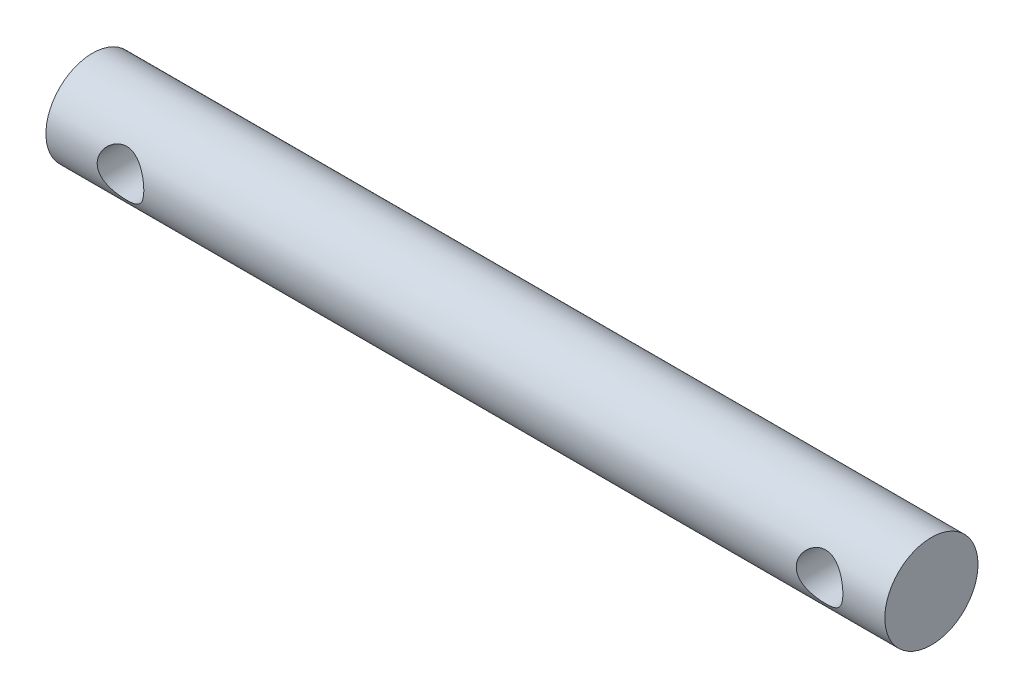
ISO-10303-21;
HEADER;
FILE_DESCRIPTION(('STEP AP214'),'2;1');
FILE_NAME('part.step','',(''),(''),'','','');
FILE_SCHEMA(('AUTOMOTIVE_DESIGN { 1 0 10303 214 1 1 1 1 }'));
ENDSEC;
DATA;
#1=APPLICATION_CONTEXT('core data for automotive mechanical design processes');
#2=APPLICATION_PROTOCOL_DEFINITION('international standard','automotive_design',2000,#1);
#3=PRODUCT_CONTEXT('',#1,'mechanical');
#4=PRODUCT('Part','Part','',(#3));
#5=PRODUCT_RELATED_PRODUCT_CATEGORY('part','',(#4));
#6=PRODUCT_DEFINITION_FORMATION('','',#4);
#7=PRODUCT_DEFINITION_CONTEXT('part definition',#1,'design');
#8=PRODUCT_DEFINITION('design','',#6,#7);
#9=PRODUCT_DEFINITION_SHAPE('','',#8);
#10=(LENGTH_UNIT() NAMED_UNIT(*) SI_UNIT(.MILLI.,.METRE.));
#11=(NAMED_UNIT(*) PLANE_ANGLE_UNIT() SI_UNIT($,.RADIAN.));
#12=(NAMED_UNIT(*) SI_UNIT($,.STERADIAN.) SOLID_ANGLE_UNIT());
#13=UNCERTAINTY_MEASURE_WITH_UNIT(LENGTH_MEASURE(1.E-05),#10,'distance_accuracy_value','');
#14=(GEOMETRIC_REPRESENTATION_CONTEXT(3) GLOBAL_UNCERTAINTY_ASSIGNED_CONTEXT((#13)) GLOBAL_UNIT_ASSIGNED_CONTEXT((#10,
#11,#12)) REPRESENTATION_CONTEXT('',''));
#15=CARTESIAN_POINT('',(0.,0.,0.));
#16=DIRECTION('',(0.,0.,1.));
#17=DIRECTION('',(1.,0.,0.));
#18=AXIS2_PLACEMENT_3D('',#15,#16,#17);
#19=CARTESIAN_POINT('',(-45.,0.,0.));
#20=DIRECTION('',(1.,0.,0.));
#21=DIRECTION('',(0.,0.,-1.));
#22=AXIS2_PLACEMENT_3D('',#19,#20,#21);
#23=CYLINDRICAL_SURFACE('',#22,2.5);
#24=CARTESIAN_POINT('',(-39.75,0.,-2.5));
#25=CARTESIAN_POINT('',(-39.7500041278994,-0.0657149536912328,-2.49999641755189));
#26=CARTESIAN_POINT('',(-39.7552125914021,-0.131508249622541,-2.49738113774397));
#27=CARTESIAN_POINT('',(-39.7758161004261,-0.261150294085531,-2.48717695046745));
#28=CARTESIAN_POINT('',(-39.7912304912471,-0.324995108391879,-2.47957859786229));
#29=CARTESIAN_POINT('',(-39.831492260771,-0.448666931100718,-2.46020349254139));
#30=CARTESIAN_POINT('',(-39.85630298031,-0.508508503673975,-2.448442989719));
#31=CARTESIAN_POINT('',(-39.9144632767062,-0.623090771008207,-2.42182220644723));
#32=CARTESIAN_POINT('',(-39.9478121803111,-0.677831867487563,-2.40696217041912));
#33=CARTESIAN_POINT('',(-40.0243965618566,-0.784384772202399,-2.37445322822571));
#34=CARTESIAN_POINT('',(-40.0681080990496,-0.835819013902638,-2.3566899890942));
#35=CARTESIAN_POINT('',(-40.1631518490588,-0.930974306083719,-2.32074962808431));
#36=CARTESIAN_POINT('',(-40.2144898147155,-0.974689478883456,-2.30257220261294));
#37=CARTESIAN_POINT('',(-40.3281041869042,-1.05656500056285,-2.26623688996684));
#38=CARTESIAN_POINT('',(-40.3909201229324,-1.09403166943955,-2.24818983712665));
#39=CARTESIAN_POINT('',(-40.5229591699828,-1.15771028361337,-2.21607473465401));
#40=CARTESIAN_POINT('',(-40.5921776609034,-1.18393026870792,-2.20200384508737));
#41=CARTESIAN_POINT('',(-40.7308313817774,-1.22266555273573,-2.18072333797261));
#42=CARTESIAN_POINT('',(-40.8000055650842,-1.23590732135055,-2.17315339479642));
#43=CARTESIAN_POINT('',(-40.9399735472243,-1.25053374163605,-2.1647736243566));
#44=CARTESIAN_POINT('',(-41.0107656760889,-1.25193011046634,-2.1639571167911));
#45=CARTESIAN_POINT('',(-41.1428575303942,-1.24335910896536,-2.16888662821561));
#46=CARTESIAN_POINT('',(-41.2042800390288,-1.23473069942102,-2.17385954577517));
#47=CARTESIAN_POINT('',(-41.3246523867163,-1.20867481132116,-2.18845285917313));
#48=CARTESIAN_POINT('',(-41.3836014316316,-1.19124452987206,-2.1980747353972));
#49=CARTESIAN_POINT('',(-41.4990364157071,-1.1477622254825,-2.22109345515926));
#50=CARTESIAN_POINT('',(-41.5554329984822,-1.12151883389499,-2.23457300829998));
#51=CARTESIAN_POINT('',(-41.6632928657375,-1.061302109585,-2.26379255351755));
#52=CARTESIAN_POINT('',(-41.7147539195001,-1.02732530476558,-2.27953355975238));
#53=CARTESIAN_POINT('',(-41.818151565929,-0.947582568640983,-2.31391447379107));
#54=CARTESIAN_POINT('',(-41.8693210919702,-0.900868072961599,-2.33266887795933));
#55=CARTESIAN_POINT('',(-41.9634192732386,-0.799444473426713,-2.36934529125509));
#56=CARTESIAN_POINT('',(-42.0063439900423,-0.744731570717853,-2.38726689948501));
#57=CARTESIAN_POINT('',(-42.0846070762872,-0.625645632289808,-2.42127484103705));
#58=CARTESIAN_POINT('',(-42.1195005905572,-0.560941989499259,-2.43723730202509));
#59=CARTESIAN_POINT('',(-42.1776212863038,-0.425582769360994,-2.46447351401553));
#60=CARTESIAN_POINT('',(-42.2008577312689,-0.354931970331593,-2.47575098679441));
#61=CARTESIAN_POINT('',(-42.2330942546458,-0.215958114575875,-2.49155417176795));
#62=CARTESIAN_POINT('',(-42.2431140446835,-0.147926913185403,-2.4965617287664));
#63=CARTESIAN_POINT('',(-42.2518309139181,-0.01097449993669,-2.50091266823877));
#64=CARTESIAN_POINT('',(-42.2505333570493,0.057946274837379,-2.5002587340164));
#65=CARTESIAN_POINT('',(-42.2372416394766,0.189041214982494,-2.49363990316801));
#66=CARTESIAN_POINT('',(-42.2260843340874,0.251324260062445,-2.48809057110237));
#67=CARTESIAN_POINT('',(-42.1947024101311,0.373008615377397,-2.47277714143524));
#68=CARTESIAN_POINT('',(-42.1744767919333,0.432409607113747,-2.46301257917916));
#69=CARTESIAN_POINT('',(-42.1250019169585,0.548610760562083,-2.43980314267087));
#70=CARTESIAN_POINT('',(-42.095511187354,0.605287996257694,-2.42626102212424));
#71=CARTESIAN_POINT('',(-42.0286155804424,0.713076702123653,-2.39679967896386));
#72=CARTESIAN_POINT('',(-41.9912073317582,0.764185787219104,-2.38087944457231));
#73=CARTESIAN_POINT('',(-41.9052994683339,0.864709611613317,-2.3463527667183));
#74=CARTESIAN_POINT('',(-41.856071414433,0.913465097280797,-2.32763606060552));
#75=CARTESIAN_POINT('',(-41.7500935609134,1.00232040139155,-2.29077989504843));
#76=CARTESIAN_POINT('',(-41.6933386014795,1.04241423211355,-2.27264084226908));
#77=CARTESIAN_POINT('',(-41.5704454322496,1.11463489312212,-2.23813990282585));
#78=CARTESIAN_POINT('',(-41.5039859172392,1.1462818698483,-2.2219066207934));
#79=CARTESIAN_POINT('',(-41.3656124153843,1.19760353251725,-2.19467590460158));
#80=CARTESIAN_POINT('',(-41.2937055918735,1.21729364485946,-2.18367172800773));
#81=CARTESIAN_POINT('',(-41.1538622214232,1.2423271093121,-2.16951876260834));
#82=CARTESIAN_POINT('',(-41.0862071832137,1.24886624550108,-2.16571729325614));
#83=CARTESIAN_POINT('',(-40.9506911660366,1.25086144297598,-2.16456693307719));
#84=CARTESIAN_POINT('',(-40.8828302890757,1.2463223082805,-2.16721524534441));
#85=CARTESIAN_POINT('',(-40.755645623085,1.22740765699032,-2.17797327562531));
#86=CARTESIAN_POINT('',(-40.6961244123195,1.21401039292849,-2.18553868102992));
#87=CARTESIAN_POINT('',(-40.5802398507191,1.1789691977808,-2.20463770234897));
#88=CARTESIAN_POINT('',(-40.523877522385,1.15732261394976,-2.21617259462095));
#89=CARTESIAN_POINT('',(-40.4117189362667,1.10476968162585,-2.2428566295566));
#90=CARTESIAN_POINT('',(-40.3562151227129,1.07333892227057,-2.25819652995238));
#91=CARTESIAN_POINT('',(-40.2509068297743,1.00268871454579,-2.29044164543238));
#92=CARTESIAN_POINT('',(-40.2011053368519,0.963465214048305,-2.30734767243153));
#93=CARTESIAN_POINT('',(-40.102322522053,0.872754158330796,-2.34327903949141));
#94=CARTESIAN_POINT('',(-40.0541761220476,0.820355528762708,-2.36231229139336));
#95=CARTESIAN_POINT('',(-39.9671712707204,0.707693507775343,-2.3984719031886));
#96=CARTESIAN_POINT('',(-39.9283178257171,0.647425904070975,-2.4155972326005));
#97=CARTESIAN_POINT('',(-39.8609545465472,0.519914496024926,-2.44622511981379));
#98=CARTESIAN_POINT('',(-39.8325197882357,0.45262437991826,-2.45970120703636));
#99=CARTESIAN_POINT('',(-39.7877397901013,0.313427626617733,-2.48126676704332));
#100=CARTESIAN_POINT('',(-39.771360191463,0.241534749528952,-2.48937154216165));
#101=CARTESIAN_POINT('',(-39.7576282361552,0.140752433104226,-2.49619327387079));
#102=CARTESIAN_POINT('',(-39.7547716989205,0.11270234929937,-2.49761706674002));
#103=CARTESIAN_POINT('',(-39.750956668104,0.0564396647589455,-2.49952121222331));
#104=CARTESIAN_POINT('',(-39.749998226911,0.028227059559226,-2.50000153879704));
#105=CARTESIAN_POINT('',(-39.75,0.,-2.5));
#106=B_SPLINE_CURVE_WITH_KNOTS('',3,(#24,#25,#26,#27,#28,#29,#30,#31,#32,#33,#34,#35,#36,#37,
#38,#39,#40,#41,#42,#43,#44,#45,#46,#47,#48,#49,#50,#51,#52,#53,#54,#55,#56,#57,#58,#59,#60,#61,
#62,#63,#64,#65,#66,#67,#68,#69,#70,#71,#72,#73,#74,#75,#76,#77,#78,#79,#80,#81,#82,#83,#84,#85,
#86,#87,#88,#89,#90,#91,#92,#93,#94,#95,#96,#97,#98,#99,#100,#101,#102,#103,#104,#105),
.UNSPECIFIED.,.T.,.F.,(4,2,2,2,2,2,2,2,2,2,2,2,2,2,2,2,2,2,2,2,2,2,2,2,2,2,2,2,2,2,2,2,2,2,2,2,
2,2,2,2,4),(0.,0.197030321775365,0.394435187136497,0.591077694365375,0.787704700726957,
0.996227198397609,1.20490779706754,1.42977158038441,1.65447434872851,1.86572515175287,
2.07676696661275,2.2625714051165,2.44843504907097,2.63862800210609,2.82890651575276,
3.04331176667347,3.25781918248357,3.4822877776805,3.70657771140348,3.91229113089181,
4.11790705639344,4.30758633132652,4.49728652038663,4.69241070034872,4.88761813435423,
5.10199513305522,5.31651985769289,5.54143352699592,5.76605639925971,5.96911634372966,
6.17208824825006,6.35572412805227,6.53941910979596,6.73545570969516,6.93159451423696,
7.15156553440622,7.37165479220715,7.59330017078655,7.81431135781161,7.8989410017212,
7.98357298143556),.UNSPECIFIED.);
#107=CARTESIAN_POINT('',(-39.75,0.,-2.5));
#108=VERTEX_POINT('',#107);
#109=EDGE_CURVE('E10',#108,#108,#106,.T.);
#110=ORIENTED_EDGE('',*,*,#109,.F.);
#111=EDGE_LOOP('',(#110));
#112=FACE_BOUND('',#111,.T.);
#113=CARTESIAN_POINT('',(-39.75,0.,2.5));
#114=CARTESIAN_POINT('',(-39.7500041278994,0.0657149536912328,2.49999641755189));
#115=CARTESIAN_POINT('',(-39.7552125914021,0.131508249622541,2.49738113774397));
#116=CARTESIAN_POINT('',(-39.7758161004261,0.261150294085531,2.48717695046745));
#117=CARTESIAN_POINT('',(-39.7912304912471,0.324995108391879,2.47957859786229));
#118=CARTESIAN_POINT('',(-39.831492260771,0.448666931100718,2.46020349254139));
#119=CARTESIAN_POINT('',(-39.85630298031,0.508508503673975,2.448442989719));
#120=CARTESIAN_POINT('',(-39.9144632767062,0.623090771008207,2.42182220644723));
#121=CARTESIAN_POINT('',(-39.9478121803111,0.677831867487563,2.40696217041912));
#122=CARTESIAN_POINT('',(-40.0243965618566,0.784384772202399,2.37445322822571));
#123=CARTESIAN_POINT('',(-40.0681080990496,0.835819013902638,2.3566899890942));
#124=CARTESIAN_POINT('',(-40.1631518490588,0.930974306083719,2.32074962808431));
#125=CARTESIAN_POINT('',(-40.2144898147155,0.974689478883456,2.30257220261294));
#126=CARTESIAN_POINT('',(-40.3281041869042,1.05656500056285,2.26623688996684));
#127=CARTESIAN_POINT('',(-40.3909201229324,1.09403166943955,2.24818983712665));
#128=CARTESIAN_POINT('',(-40.5229591699828,1.15771028361337,2.21607473465401));
#129=CARTESIAN_POINT('',(-40.5921776609034,1.18393026870792,2.20200384508737));
#130=CARTESIAN_POINT('',(-40.7308313817774,1.22266555273573,2.18072333797261));
#131=CARTESIAN_POINT('',(-40.8000055650842,1.23590732135055,2.17315339479642));
#132=CARTESIAN_POINT('',(-40.9399735472243,1.25053374163605,2.1647736243566));
#133=CARTESIAN_POINT('',(-41.0107656760889,1.25193011046634,2.1639571167911));
#134=CARTESIAN_POINT('',(-41.1428575303942,1.24335910896536,2.16888662821561));
#135=CARTESIAN_POINT('',(-41.2042800390288,1.23473069942102,2.17385954577517));
#136=CARTESIAN_POINT('',(-41.3246523867163,1.20867481132116,2.18845285917313));
#137=CARTESIAN_POINT('',(-41.3836014316316,1.19124452987206,2.1980747353972));
#138=CARTESIAN_POINT('',(-41.4990364157071,1.1477622254825,2.22109345515926));
#139=CARTESIAN_POINT('',(-41.5554329984822,1.12151883389499,2.23457300829998));
#140=CARTESIAN_POINT('',(-41.6632928657375,1.061302109585,2.26379255351755));
#141=CARTESIAN_POINT('',(-41.7147539195001,1.02732530476558,2.27953355975238));
#142=CARTESIAN_POINT('',(-41.818151565929,0.947582568640983,2.31391447379107));
#143=CARTESIAN_POINT('',(-41.8693210919702,0.900868072961599,2.33266887795933));
#144=CARTESIAN_POINT('',(-41.9634192732386,0.799444473426713,2.36934529125509));
#145=CARTESIAN_POINT('',(-42.0063439900423,0.744731570717853,2.38726689948501));
#146=CARTESIAN_POINT('',(-42.0846070762872,0.625645632289808,2.42127484103705));
#147=CARTESIAN_POINT('',(-42.1195005905572,0.560941989499259,2.43723730202509));
#148=CARTESIAN_POINT('',(-42.1776212863038,0.425582769360994,2.46447351401553));
#149=CARTESIAN_POINT('',(-42.2008577312689,0.354931970331593,2.47575098679441));
#150=CARTESIAN_POINT('',(-42.2330942546458,0.215958114575875,2.49155417176795));
#151=CARTESIAN_POINT('',(-42.2431140446835,0.147926913185403,2.4965617287664));
#152=CARTESIAN_POINT('',(-42.2518309139181,0.01097449993669,2.50091266823877));
#153=CARTESIAN_POINT('',(-42.2505333570493,-0.057946274837379,2.5002587340164));
#154=CARTESIAN_POINT('',(-42.2372416394766,-0.189041214982494,2.49363990316801));
#155=CARTESIAN_POINT('',(-42.2260843340874,-0.251324260062445,2.48809057110237));
#156=CARTESIAN_POINT('',(-42.1947024101311,-0.373008615377397,2.47277714143524));
#157=CARTESIAN_POINT('',(-42.1744767919333,-0.432409607113747,2.46301257917916));
#158=CARTESIAN_POINT('',(-42.1250019169585,-0.548610760562083,2.43980314267087));
#159=CARTESIAN_POINT('',(-42.095511187354,-0.605287996257694,2.42626102212424));
#160=CARTESIAN_POINT('',(-42.0286155804424,-0.713076702123653,2.39679967896386));
#161=CARTESIAN_POINT('',(-41.9912073317582,-0.764185787219104,2.38087944457231));
#162=CARTESIAN_POINT('',(-41.9052994683339,-0.864709611613317,2.3463527667183));
#163=CARTESIAN_POINT('',(-41.856071414433,-0.913465097280797,2.32763606060552));
#164=CARTESIAN_POINT('',(-41.7500935609134,-1.00232040139155,2.29077989504843));
#165=CARTESIAN_POINT('',(-41.6933386014795,-1.04241423211355,2.27264084226908));
#166=CARTESIAN_POINT('',(-41.5704454322496,-1.11463489312212,2.23813990282585));
#167=CARTESIAN_POINT('',(-41.5039859172392,-1.1462818698483,2.2219066207934));
#168=CARTESIAN_POINT('',(-41.3656124153843,-1.19760353251725,2.19467590460158));
#169=CARTESIAN_POINT('',(-41.2937055918735,-1.21729364485946,2.18367172800773));
#170=CARTESIAN_POINT('',(-41.1538622214232,-1.2423271093121,2.16951876260834));
#171=CARTESIAN_POINT('',(-41.0862071832137,-1.24886624550108,2.16571729325614));
#172=CARTESIAN_POINT('',(-40.9506911660366,-1.25086144297598,2.16456693307719));
#173=CARTESIAN_POINT('',(-40.8828302890757,-1.2463223082805,2.16721524534441));
#174=CARTESIAN_POINT('',(-40.755645623085,-1.22740765699032,2.17797327562531));
#175=CARTESIAN_POINT('',(-40.6961244123195,-1.21401039292849,2.18553868102992));
#176=CARTESIAN_POINT('',(-40.5802398507191,-1.1789691977808,2.20463770234897));
#177=CARTESIAN_POINT('',(-40.523877522385,-1.15732261394976,2.21617259462095));
#178=CARTESIAN_POINT('',(-40.4117189362667,-1.10476968162585,2.2428566295566));
#179=CARTESIAN_POINT('',(-40.3562151227129,-1.07333892227057,2.25819652995238));
#180=CARTESIAN_POINT('',(-40.2509068297743,-1.00268871454579,2.29044164543238));
#181=CARTESIAN_POINT('',(-40.2011053368519,-0.963465214048305,2.30734767243153));
#182=CARTESIAN_POINT('',(-40.102322522053,-0.872754158330796,2.34327903949141));
#183=CARTESIAN_POINT('',(-40.0541761220476,-0.820355528762708,2.36231229139336));
#184=CARTESIAN_POINT('',(-39.9671712707204,-0.707693507775343,2.3984719031886));
#185=CARTESIAN_POINT('',(-39.9283178257171,-0.647425904070975,2.4155972326005));
#186=CARTESIAN_POINT('',(-39.8609545465472,-0.519914496024926,2.44622511981379));
#187=CARTESIAN_POINT('',(-39.8325197882357,-0.45262437991826,2.45970120703636));
#188=CARTESIAN_POINT('',(-39.7877397901013,-0.313427626617733,2.48126676704332));
#189=CARTESIAN_POINT('',(-39.771360191463,-0.241534749528952,2.48937154216165));
#190=CARTESIAN_POINT('',(-39.7576282361552,-0.140752433104226,2.49619327387079));
#191=CARTESIAN_POINT('',(-39.7547716989205,-0.11270234929937,2.49761706674002));
#192=CARTESIAN_POINT('',(-39.750956668104,-0.0564396647589455,2.49952121222331));
#193=CARTESIAN_POINT('',(-39.749998226911,-0.028227059559226,2.50000153879704));
#194=CARTESIAN_POINT('',(-39.75,0.,2.5));
#195=B_SPLINE_CURVE_WITH_KNOTS('',3,(#113,#114,#115,#116,#117,#118,#119,#120,#121,#122,#123,
#124,#125,#126,#127,#128,#129,#130,#131,#132,#133,#134,#135,#136,#137,#138,#139,#140,#141,#142,
#143,#144,#145,#146,#147,#148,#149,#150,#151,#152,#153,#154,#155,#156,#157,#158,#159,#160,#161,
#162,#163,#164,#165,#166,#167,#168,#169,#170,#171,#172,#173,#174,#175,#176,#177,#178,#179,#180,
#181,#182,#183,#184,#185,#186,#187,#188,#189,#190,#191,#192,#193,#194),.UNSPECIFIED.,.T.,.F.,(4,
2,2,2,2,2,2,2,2,2,2,2,2,2,2,2,2,2,2,2,2,2,2,2,2,2,2,2,2,2,2,2,2,2,2,2,2,2,2,2,4),(0.,
0.197030321775365,0.394435187136497,0.591077694365375,0.787704700726957,0.996227198397609,
1.20490779706754,1.42977158038441,1.65447434872851,1.86572515175287,2.07676696661275,
2.2625714051165,2.44843504907097,2.63862800210609,2.82890651575276,3.04331176667347,
3.25781918248357,3.4822877776805,3.70657771140348,3.91229113089181,4.11790705639344,
4.30758633132652,4.49728652038663,4.69241070034872,4.88761813435423,5.10199513305522,
5.31651985769289,5.54143352699592,5.76605639925971,5.96911634372966,6.17208824825006,
6.35572412805227,6.53941910979596,6.73545570969516,6.93159451423696,7.15156553440622,
7.37165479220715,7.59330017078655,7.81431135781161,7.8989410017212,7.98357298143556),.UNSPECIFIED.);
#196=CARTESIAN_POINT('',(-39.75,0.,2.5));
#197=VERTEX_POINT('',#196);
#198=EDGE_CURVE('E48',#197,#197,#195,.T.);
#199=ORIENTED_EDGE('',*,*,#198,.F.);
#200=EDGE_LOOP('',(#199));
#201=FACE_BOUND('',#200,.T.);
#202=CARTESIAN_POINT('',(-2.25,0.,-2.5));
#203=CARTESIAN_POINT('',(-2.25000412789938,-0.0657149536912332,-2.49999641755189));
#204=CARTESIAN_POINT('',(-2.25521259140209,-0.131508249622541,-2.49738113774397));
#205=CARTESIAN_POINT('',(-2.27581610042615,-0.261150294085532,-2.48717695046745));
#206=CARTESIAN_POINT('',(-2.29123049124706,-0.32499510839188,-2.47957859786229));
#207=CARTESIAN_POINT('',(-2.33149226077099,-0.448666931100718,-2.46020349254139));
#208=CARTESIAN_POINT('',(-2.35630298031002,-0.508508503673975,-2.448442989719));
#209=CARTESIAN_POINT('',(-2.41446327670618,-0.623090771008207,-2.42182220644723));
#210=CARTESIAN_POINT('',(-2.44781218031107,-0.677831867487563,-2.40696217041912));
#211=CARTESIAN_POINT('',(-2.52439656185662,-0.784384772202399,-2.37445322822571));
#212=CARTESIAN_POINT('',(-2.56810809904955,-0.83581901390264,-2.3566899890942));
#213=CARTESIAN_POINT('',(-2.66315184905879,-0.930974306083722,-2.3207496280843));
#214=CARTESIAN_POINT('',(-2.71448981471555,-0.974689478883458,-2.30257220261294));
#215=CARTESIAN_POINT('',(-2.82810418690423,-1.05656500056285,-2.26623688996684));
#216=CARTESIAN_POINT('',(-2.89092012293239,-1.09403166943955,-2.24818983712665));
#217=CARTESIAN_POINT('',(-3.02295916998277,-1.15771028361337,-2.21607473465401));
#218=CARTESIAN_POINT('',(-3.09217766090344,-1.18393026870792,-2.20200384508737));
#219=CARTESIAN_POINT('',(-3.2308313817774,-1.22266555273574,-2.18072333797261));
#220=CARTESIAN_POINT('',(-3.30000556508424,-1.23590732135055,-2.17315339479642));
#221=CARTESIAN_POINT('',(-3.43997354722435,-1.25053374163606,-2.1647736243566));
#222=CARTESIAN_POINT('',(-3.51076567608894,-1.25193011046634,-2.1639571167911));
#223=CARTESIAN_POINT('',(-3.64285753039421,-1.24335910896537,-2.16888662821561));
#224=CARTESIAN_POINT('',(-3.70428003902881,-1.23473069942103,-2.17385954577517));
#225=CARTESIAN_POINT('',(-3.8246523867163,-1.20867481132117,-2.18845285917313));
#226=CARTESIAN_POINT('',(-3.88360143163164,-1.19124452987206,-2.1980747353972));
#227=CARTESIAN_POINT('',(-3.99903641570707,-1.1477622254825,-2.22109345515926));
#228=CARTESIAN_POINT('',(-4.05543299848223,-1.12151883389499,-2.23457300829998));
#229=CARTESIAN_POINT('',(-4.16329286573751,-1.061302109585,-2.26379255351755));
#230=CARTESIAN_POINT('',(-4.21475391950011,-1.02732530476558,-2.27953355975238));
#231=CARTESIAN_POINT('',(-4.31815156592903,-0.947582568640985,-2.31391447379107));
#232=CARTESIAN_POINT('',(-4.3693210919702,-0.900868072961602,-2.33266887795933));
#233=CARTESIAN_POINT('',(-4.46341927323863,-0.799444473426716,-2.36934529125509));
#234=CARTESIAN_POINT('',(-4.50634399004235,-0.744731570717856,-2.38726689948501));
#235=CARTESIAN_POINT('',(-4.58460707628716,-0.625645632289809,-2.42127484103705));
#236=CARTESIAN_POINT('',(-4.61950059055718,-0.560941989499259,-2.43723730202509));
#237=CARTESIAN_POINT('',(-4.67762128630376,-0.425582769360995,-2.46447351401553));
#238=CARTESIAN_POINT('',(-4.70085773126896,-0.354931970331594,-2.47575098679441));
#239=CARTESIAN_POINT('',(-4.73309425464584,-0.215958114575876,-2.49155417176795));
#240=CARTESIAN_POINT('',(-4.74311404468347,-0.147926913185404,-2.4965617287664));
#241=CARTESIAN_POINT('',(-4.75183091391811,-0.0109744999366908,-2.50091266823877));
#242=CARTESIAN_POINT('',(-4.75053335704935,0.057946274837378,-2.5002587340164));
#243=CARTESIAN_POINT('',(-4.73724163947656,0.189041214982493,-2.49363990316801));
#244=CARTESIAN_POINT('',(-4.72608433408746,0.251324260062444,-2.48809057110237));
#245=CARTESIAN_POINT('',(-4.69470241013114,0.373008615377397,-2.47277714143524));
#246=CARTESIAN_POINT('',(-4.6744767919333,0.432409607113746,-2.46301257917916));
#247=CARTESIAN_POINT('',(-4.62500191695853,0.548610760562082,-2.43980314267087));
#248=CARTESIAN_POINT('',(-4.59551118735398,0.605287996257692,-2.42626102212424));
#249=CARTESIAN_POINT('',(-4.52861558044245,0.713076702123651,-2.39679967896386));
#250=CARTESIAN_POINT('',(-4.49120733175821,0.764185787219102,-2.38087944457231));
#251=CARTESIAN_POINT('',(-4.40529946833391,0.864709611613316,-2.34635276671831));
#252=CARTESIAN_POINT('',(-4.35607141443304,0.913465097280798,-2.32763606060552));
#253=CARTESIAN_POINT('',(-4.25009356091337,1.00232040139155,-2.29077989504843));
#254=CARTESIAN_POINT('',(-4.19333860147953,1.04241423211355,-2.27264084226908));
#255=CARTESIAN_POINT('',(-4.07044543224961,1.11463489312212,-2.23813990282585));
#256=CARTESIAN_POINT('',(-4.00398591723926,1.1462818698483,-2.2219066207934));
#257=CARTESIAN_POINT('',(-3.86561241538435,1.19760353251725,-2.19467590460158));
#258=CARTESIAN_POINT('',(-3.79370559187352,1.21729364485946,-2.18367172800773));
#259=CARTESIAN_POINT('',(-3.65386222142319,1.2423271093121,-2.16951876260834));
#260=CARTESIAN_POINT('',(-3.5862071832137,1.24886624550108,-2.16571729325614));
#261=CARTESIAN_POINT('',(-3.45069116603659,1.25086144297598,-2.16456693307719));
#262=CARTESIAN_POINT('',(-3.38283028907571,1.2463223082805,-2.16721524534441));
#263=CARTESIAN_POINT('',(-3.25564562308498,1.22740765699033,-2.17797327562531));
#264=CARTESIAN_POINT('',(-3.1961244123195,1.2140103929285,-2.18553868102992));
#265=CARTESIAN_POINT('',(-3.08023985071912,1.17896919778081,-2.20463770234897));
#266=CARTESIAN_POINT('',(-3.02387752238504,1.15732261394976,-2.21617259462095));
#267=CARTESIAN_POINT('',(-2.91171893626674,1.10476968162585,-2.2428566295566));
#268=CARTESIAN_POINT('',(-2.85621512271287,1.07333892227057,-2.25819652995238));
#269=CARTESIAN_POINT('',(-2.75090682977427,1.00268871454579,-2.29044164543238));
#270=CARTESIAN_POINT('',(-2.70110533685189,0.963465214048309,-2.30734767243153));
#271=CARTESIAN_POINT('',(-2.60232252205298,0.8727541583308,-2.34327903949141));
#272=CARTESIAN_POINT('',(-2.5541761220476,0.820355528762713,-2.36231229139336));
#273=CARTESIAN_POINT('',(-2.46717127072046,0.707693507775348,-2.3984719031886));
#274=CARTESIAN_POINT('',(-2.42831782571714,0.647425904070981,-2.4155972326005));
#275=CARTESIAN_POINT('',(-2.36095454654725,0.519914496024933,-2.44622511981379));
#276=CARTESIAN_POINT('',(-2.33251978823571,0.452624379918268,-2.45970120703636));
#277=CARTESIAN_POINT('',(-2.28773979010131,0.313427626617739,-2.48126676704332));
#278=CARTESIAN_POINT('',(-2.27136019146303,0.241534749528957,-2.48937154216165));
#279=CARTESIAN_POINT('',(-2.25762823615519,0.14075243310423,-2.49619327387079));
#280=CARTESIAN_POINT('',(-2.25477169892048,0.112702349299373,-2.49761706674002));
#281=CARTESIAN_POINT('',(-2.25095666810399,0.056439664758947,-2.49952121222331));
#282=CARTESIAN_POINT('',(-2.249998226911,0.0282270595592267,-2.50000153879704));
#283=CARTESIAN_POINT('',(-2.25,0.,-2.5));
#284=B_SPLINE_CURVE_WITH_KNOTS('',3,(#202,#203,#204,#205,#206,#207,#208,#209,#210,#211,#212,
#213,#214,#215,#216,#217,#218,#219,#220,#221,#222,#223,#224,#225,#226,#227,#228,#229,#230,#231,
#232,#233,#234,#235,#236,#237,#238,#239,#240,#241,#242,#243,#244,#245,#246,#247,#248,#249,#250,
#251,#252,#253,#254,#255,#256,#257,#258,#259,#260,#261,#262,#263,#264,#265,#266,#267,#268,#269,
#270,#271,#272,#273,#274,#275,#276,#277,#278,#279,#280,#281,#282,#283),.UNSPECIFIED.,.T.,.F.,(4,
2,2,2,2,2,2,2,2,2,2,2,2,2,2,2,2,2,2,2,2,2,2,2,2,2,2,2,2,2,2,2,2,2,2,2,2,2,2,2,4),(0.,
0.197030321775366,0.394435187136498,0.591077694365373,0.78770470072696,0.996227198397612,
1.20490779706755,1.42977158038441,1.65447434872851,1.86572515175287,2.07676696661275,
2.2625714051165,2.44843504907098,2.63862800210609,2.82890651575277,3.04331176667348,
3.25781918248358,3.48228777768051,3.70657771140349,3.91229113089182,4.11790705639345,
4.30758633132652,4.49728652038664,4.69241070034873,4.88761813435424,5.10199513305523,
5.31651985769289,5.54143352699592,5.76605639925972,5.96911634372967,6.17208824825007,
6.35572412805228,6.53941910979598,6.73545570969518,6.93159451423697,7.15156553440623,
7.37165479220716,7.59330017078656,7.81431135781162,7.89894100172122,7.98357298143558),.UNSPECIFIED.);
#285=CARTESIAN_POINT('',(-2.25,0.,-2.5));
#286=VERTEX_POINT('',#285);
#287=EDGE_CURVE('E55',#286,#286,#284,.T.);
#288=ORIENTED_EDGE('',*,*,#287,.F.);
#289=EDGE_LOOP('',(#288));
#290=FACE_BOUND('',#289,.T.);
#291=CARTESIAN_POINT('',(-2.25,0.,2.5));
#292=CARTESIAN_POINT('',(-2.25000412789938,0.0657149536912332,2.49999641755189));
#293=CARTESIAN_POINT('',(-2.25521259140209,0.131508249622541,2.49738113774397));
#294=CARTESIAN_POINT('',(-2.27581610042615,0.261150294085532,2.48717695046745));
#295=CARTESIAN_POINT('',(-2.29123049124706,0.32499510839188,2.47957859786229));
#296=CARTESIAN_POINT('',(-2.33149226077099,0.448666931100718,2.46020349254139));
#297=CARTESIAN_POINT('',(-2.35630298031002,0.508508503673975,2.448442989719));
#298=CARTESIAN_POINT('',(-2.41446327670618,0.623090771008207,2.42182220644723));
#299=CARTESIAN_POINT('',(-2.44781218031107,0.677831867487563,2.40696217041912));
#300=CARTESIAN_POINT('',(-2.52439656185662,0.784384772202399,2.37445322822571));
#301=CARTESIAN_POINT('',(-2.56810809904955,0.83581901390264,2.3566899890942));
#302=CARTESIAN_POINT('',(-2.66315184905879,0.930974306083722,2.3207496280843));
#303=CARTESIAN_POINT('',(-2.71448981471555,0.974689478883459,2.30257220261294));
#304=CARTESIAN_POINT('',(-2.82810418690423,1.05656500056285,2.26623688996684));
#305=CARTESIAN_POINT('',(-2.89092012293239,1.09403166943955,2.24818983712665));
#306=CARTESIAN_POINT('',(-3.02295916998277,1.15771028361337,2.21607473465401));
#307=CARTESIAN_POINT('',(-3.09217766090344,1.18393026870792,2.20200384508737));
#308=CARTESIAN_POINT('',(-3.2308313817774,1.22266555273574,2.18072333797261));
#309=CARTESIAN_POINT('',(-3.30000556508424,1.23590732135055,2.17315339479642));
#310=CARTESIAN_POINT('',(-3.43997354722435,1.25053374163606,2.1647736243566));
#311=CARTESIAN_POINT('',(-3.51076567608894,1.25193011046634,2.1639571167911));
#312=CARTESIAN_POINT('',(-3.64285753039421,1.24335910896537,2.16888662821561));
#313=CARTESIAN_POINT('',(-3.70428003902881,1.23473069942103,2.17385954577517));
#314=CARTESIAN_POINT('',(-3.8246523867163,1.20867481132117,2.18845285917313));
#315=CARTESIAN_POINT('',(-3.88360143163164,1.19124452987206,2.1980747353972));
#316=CARTESIAN_POINT('',(-3.99903641570707,1.1477622254825,2.22109345515926));
#317=CARTESIAN_POINT('',(-4.05543299848223,1.12151883389499,2.23457300829998));
#318=CARTESIAN_POINT('',(-4.16329286573751,1.061302109585,2.26379255351755));
#319=CARTESIAN_POINT('',(-4.21475391950011,1.02732530476558,2.27953355975238));
#320=CARTESIAN_POINT('',(-4.31815156592903,0.947582568640985,2.31391447379107));
#321=CARTESIAN_POINT('',(-4.3693210919702,0.900868072961602,2.33266887795933));
#322=CARTESIAN_POINT('',(-4.46341927323863,0.799444473426716,2.36934529125509));
#323=CARTESIAN_POINT('',(-4.50634399004235,0.744731570717856,2.38726689948501));
#324=CARTESIAN_POINT('',(-4.58460707628716,0.625645632289809,2.42127484103705));
#325=CARTESIAN_POINT('',(-4.61950059055718,0.560941989499259,2.43723730202509));
#326=CARTESIAN_POINT('',(-4.67762128630376,0.425582769360994,2.46447351401553));
#327=CARTESIAN_POINT('',(-4.70085773126896,0.354931970331594,2.47575098679441));
#328=CARTESIAN_POINT('',(-4.73309425464584,0.215958114575876,2.49155417176795));
#329=CARTESIAN_POINT('',(-4.74311404468347,0.147926913185404,2.4965617287664));
#330=CARTESIAN_POINT('',(-4.75183091391811,0.0109744999366908,2.50091266823877));
#331=CARTESIAN_POINT('',(-4.75053335704935,-0.0579462748373778,2.5002587340164));
#332=CARTESIAN_POINT('',(-4.73724163947656,-0.189041214982493,2.49363990316801));
#333=CARTESIAN_POINT('',(-4.72608433408746,-0.251324260062443,2.48809057110237));
#334=CARTESIAN_POINT('',(-4.69470241013114,-0.373008615377396,2.47277714143524));
#335=CARTESIAN_POINT('',(-4.6744767919333,-0.432409607113746,2.46301257917916));
#336=CARTESIAN_POINT('',(-4.62500191695853,-0.548610760562082,2.43980314267087));
#337=CARTESIAN_POINT('',(-4.59551118735398,-0.605287996257692,2.42626102212424));
#338=CARTESIAN_POINT('',(-4.52861558044245,-0.713076702123651,2.39679967896386));
#339=CARTESIAN_POINT('',(-4.49120733175821,-0.764185787219102,2.38087944457231));
#340=CARTESIAN_POINT('',(-4.40529946833391,-0.864709611613316,2.34635276671831));
#341=CARTESIAN_POINT('',(-4.35607141443304,-0.913465097280798,2.32763606060552));
#342=CARTESIAN_POINT('',(-4.25009356091337,-1.00232040139155,2.29077989504843));
#343=CARTESIAN_POINT('',(-4.19333860147953,-1.04241423211355,2.27264084226908));
#344=CARTESIAN_POINT('',(-4.07044543224961,-1.11463489312212,2.23813990282585));
#345=CARTESIAN_POINT('',(-4.00398591723926,-1.1462818698483,2.2219066207934));
#346=CARTESIAN_POINT('',(-3.86561241538435,-1.19760353251725,2.19467590460158));
#347=CARTESIAN_POINT('',(-3.79370559187352,-1.21729364485946,2.18367172800773));
#348=CARTESIAN_POINT('',(-3.65386222142319,-1.2423271093121,2.16951876260834));
#349=CARTESIAN_POINT('',(-3.5862071832137,-1.24886624550108,2.16571729325614));
#350=CARTESIAN_POINT('',(-3.45069116603659,-1.25086144297598,2.16456693307719));
#351=CARTESIAN_POINT('',(-3.38283028907571,-1.2463223082805,2.16721524534441));
#352=CARTESIAN_POINT('',(-3.25564562308498,-1.22740765699033,2.17797327562531));
#353=CARTESIAN_POINT('',(-3.1961244123195,-1.2140103929285,2.18553868102992));
#354=CARTESIAN_POINT('',(-3.08023985071912,-1.17896919778081,2.20463770234897));
#355=CARTESIAN_POINT('',(-3.02387752238504,-1.15732261394976,2.21617259462095));
#356=CARTESIAN_POINT('',(-2.91171893626674,-1.10476968162585,2.2428566295566));
#357=CARTESIAN_POINT('',(-2.85621512271287,-1.07333892227057,2.25819652995238));
#358=CARTESIAN_POINT('',(-2.75090682977427,-1.00268871454579,2.29044164543238));
#359=CARTESIAN_POINT('',(-2.70110533685189,-0.96346521404831,2.30734767243153));
#360=CARTESIAN_POINT('',(-2.60232252205298,-0.872754158330801,2.34327903949141));
#361=CARTESIAN_POINT('',(-2.5541761220476,-0.820355528762714,2.36231229139336));
#362=CARTESIAN_POINT('',(-2.46717127072046,-0.70769350777535,2.3984719031886));
#363=CARTESIAN_POINT('',(-2.42831782571714,-0.647425904070982,2.4155972326005));
#364=CARTESIAN_POINT('',(-2.36095454654725,-0.519914496024934,2.44622511981379));
#365=CARTESIAN_POINT('',(-2.33251978823571,-0.452624379918268,2.45970120703636));
#366=CARTESIAN_POINT('',(-2.28773979010131,-0.313427626617739,2.48126676704332));
#367=CARTESIAN_POINT('',(-2.27136019146303,-0.241534749528958,2.48937154216165));
#368=CARTESIAN_POINT('',(-2.25762823615519,-0.14075243310423,2.49619327387079));
#369=CARTESIAN_POINT('',(-2.25477169892048,-0.112702349299373,2.49761706674002));
#370=CARTESIAN_POINT('',(-2.25095666810399,-0.056439664758947,2.49952121222331));
#371=CARTESIAN_POINT('',(-2.249998226911,-0.0282270595592267,2.50000153879704));
#372=CARTESIAN_POINT('',(-2.25,0.,2.5));
#373=B_SPLINE_CURVE_WITH_KNOTS('',3,(#291,#292,#293,#294,#295,#296,#297,#298,#299,#300,#301,
#302,#303,#304,#305,#306,#307,#308,#309,#310,#311,#312,#313,#314,#315,#316,#317,#318,#319,#320,
#321,#322,#323,#324,#325,#326,#327,#328,#329,#330,#331,#332,#333,#334,#335,#336,#337,#338,#339,
#340,#341,#342,#343,#344,#345,#346,#347,#348,#349,#350,#351,#352,#353,#354,#355,#356,#357,#358,
#359,#360,#361,#362,#363,#364,#365,#366,#367,#368,#369,#370,#371,#372),.UNSPECIFIED.,.T.,.F.,(4,
2,2,2,2,2,2,2,2,2,2,2,2,2,2,2,2,2,2,2,2,2,2,2,2,2,2,2,2,2,2,2,2,2,2,2,2,2,2,2,4),(0.,
0.197030321775366,0.394435187136497,0.591077694365373,0.78770470072696,0.996227198397612,
1.20490779706755,1.42977158038441,1.65447434872851,1.86572515175287,2.07676696661275,
2.2625714051165,2.44843504907098,2.63862800210609,2.82890651575277,3.04331176667348,
3.25781918248358,3.48228777768051,3.70657771140349,3.91229113089182,4.11790705639345,
4.30758633132652,4.49728652038664,4.69241070034873,4.88761813435424,5.10199513305523,
5.31651985769289,5.54143352699592,5.76605639925972,5.96911634372967,6.17208824825007,
6.35572412805228,6.53941910979597,6.73545570969518,6.93159451423697,7.15156553440623,
7.37165479220716,7.59330017078656,7.81431135781162,7.89894100172122,7.98357298143558),.UNSPECIFIED.);
#374=CARTESIAN_POINT('',(-2.25,0.,2.5));
#375=VERTEX_POINT('',#374);
#376=EDGE_CURVE('E57',#375,#375,#373,.T.);
#377=ORIENTED_EDGE('',*,*,#376,.F.);
#378=EDGE_LOOP('',(#377));
#379=FACE_BOUND('',#378,.T.);
#380=CARTESIAN_POINT('',(-45.,0.,0.));
#381=DIRECTION('',(1.,0.,0.));
#382=DIRECTION('',(0.,0.,-1.));
#383=AXIS2_PLACEMENT_3D('',#380,#381,#382);
#384=CIRCLE('',#383,2.5);
#385=CARTESIAN_POINT('',(-45.,0.,-2.5));
#386=VERTEX_POINT('',#385);
#387=EDGE_CURVE('E82',#386,#386,#384,.T.);
#388=ORIENTED_EDGE('',*,*,#387,.T.);
#389=EDGE_LOOP('',(#388));
#390=FACE_BOUND('',#389,.T.);
#391=CARTESIAN_POINT('',(0.,0.,0.));
#392=DIRECTION('',(1.,0.,0.));
#393=DIRECTION('',(0.,0.,-1.));
#394=AXIS2_PLACEMENT_3D('',#391,#392,#393);
#395=CIRCLE('',#394,2.5);
#396=CARTESIAN_POINT('',(0.,0.,-2.5));
#397=VERTEX_POINT('',#396);
#398=EDGE_CURVE('E85',#397,#397,#395,.T.);
#399=ORIENTED_EDGE('',*,*,#398,.F.);
#400=EDGE_LOOP('',(#399));
#401=FACE_BOUND('',#400,.T.);
#402=ADVANCED_FACE('F40',(#112,#201,#290,#379,#390,#401),#23,.T.);
#403=CARTESIAN_POINT('',(-45.,0.,0.));
#404=DIRECTION('',(1.,0.,0.));
#405=DIRECTION('',(0.,0.,-1.));
#406=AXIS2_PLACEMENT_3D('',#403,#404,#405);
#407=PLANE('',#406);
#408=ORIENTED_EDGE('',*,*,#387,.F.);
#409=EDGE_LOOP('',(#408));
#410=FACE_BOUND('',#409,.T.);
#411=ADVANCED_FACE('F77',(#410),#407,.F.);
#412=CARTESIAN_POINT('',(0.,0.,0.));
#413=DIRECTION('',(1.,0.,0.));
#414=DIRECTION('',(0.,0.,-1.));
#415=AXIS2_PLACEMENT_3D('',#412,#413,#414);
#416=PLANE('',#415);
#417=ORIENTED_EDGE('',*,*,#398,.T.);
#418=EDGE_LOOP('',(#417));
#419=FACE_BOUND('',#418,.T.);
#420=ADVANCED_FACE('F74',(#419),#416,.T.);
#421=CARTESIAN_POINT('',(-3.5,0.,-2.5));
#422=DIRECTION('',(0.,0.,1.));
#423=DIRECTION('',(1.,0.,0.));
#424=AXIS2_PLACEMENT_3D('',#421,#422,#423);
#425=CYLINDRICAL_SURFACE('',#424,1.25);
#426=ORIENTED_EDGE('',*,*,#287,.T.);
#427=EDGE_LOOP('',(#426));
#428=FACE_BOUND('',#427,.T.);
#429=ORIENTED_EDGE('',*,*,#376,.T.);
#430=EDGE_LOOP('',(#429));
#431=FACE_BOUND('',#430,.T.);
#432=ADVANCED_FACE('F70',(#428,#431),#425,.F.);
#433=CARTESIAN_POINT('',(-41.,0.,-2.5));
#434=DIRECTION('',(0.,0.,1.));
#435=DIRECTION('',(1.,0.,0.));
#436=AXIS2_PLACEMENT_3D('',#433,#434,#435);
#437=CYLINDRICAL_SURFACE('',#436,1.25);
#438=ORIENTED_EDGE('',*,*,#109,.T.);
#439=EDGE_LOOP('',(#438));
#440=FACE_BOUND('',#439,.T.);
#441=ORIENTED_EDGE('',*,*,#198,.T.);
#442=EDGE_LOOP('',(#441));
#443=FACE_BOUND('',#442,.T.);
#444=ADVANCED_FACE('F68',(#440,#443),#437,.F.);
#445=CLOSED_SHELL('',(#402,#411,#420,#432,#444));
#446=MANIFOLD_SOLID_BREP('B2',#445);
#447=ADVANCED_BREP_SHAPE_REPRESENTATION('',(#18,#446),#14);
#448=SHAPE_DEFINITION_REPRESENTATION(#9,#447);
ENDSEC;
END-ISO-10303-21;
